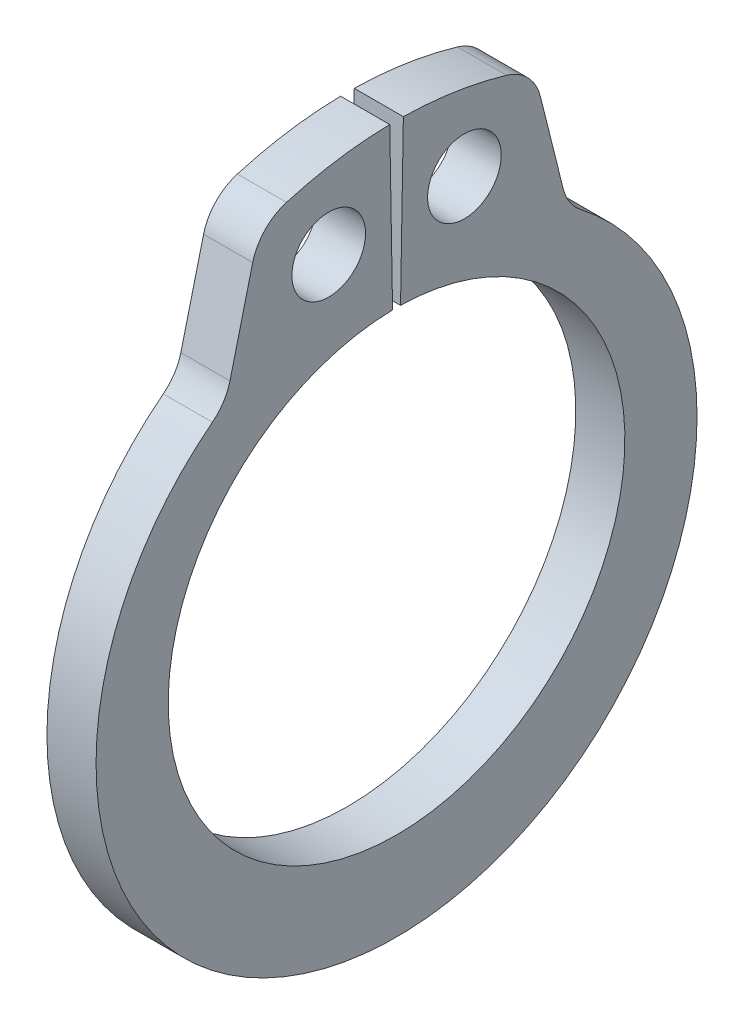
ISO-10303-21;
HEADER;
FILE_DESCRIPTION(('STEP AP214'),'2;1');
FILE_NAME('part.step','',(''),(''),'','','');
FILE_SCHEMA(('AUTOMOTIVE_DESIGN { 1 0 10303 214 1 1 1 1 }'));
ENDSEC;
DATA;
#1=APPLICATION_CONTEXT('core data for automotive mechanical design processes');
#2=APPLICATION_PROTOCOL_DEFINITION('international standard','automotive_design',2000,#1);
#3=PRODUCT_CONTEXT('',#1,'mechanical');
#4=PRODUCT('Part','Part','',(#3));
#5=PRODUCT_RELATED_PRODUCT_CATEGORY('part','',(#4));
#6=PRODUCT_DEFINITION_FORMATION('','',#4);
#7=PRODUCT_DEFINITION_CONTEXT('part definition',#1,'design');
#8=PRODUCT_DEFINITION('design','',#6,#7);
#9=PRODUCT_DEFINITION_SHAPE('','',#8);
#10=(LENGTH_UNIT() NAMED_UNIT(*) SI_UNIT(.MILLI.,.METRE.));
#11=(NAMED_UNIT(*) PLANE_ANGLE_UNIT() SI_UNIT($,.RADIAN.));
#12=(NAMED_UNIT(*) SI_UNIT($,.STERADIAN.) SOLID_ANGLE_UNIT());
#13=UNCERTAINTY_MEASURE_WITH_UNIT(LENGTH_MEASURE(1.E-05),#10,'distance_accuracy_value','');
#14=(GEOMETRIC_REPRESENTATION_CONTEXT(3) GLOBAL_UNCERTAINTY_ASSIGNED_CONTEXT((#13)) GLOBAL_UNIT_ASSIGNED_CONTEXT((#10,
#11,#12)) REPRESENTATION_CONTEXT('',''));
#15=CARTESIAN_POINT('',(0.,0.,0.));
#16=DIRECTION('',(0.,0.,1.));
#17=DIRECTION('',(1.,0.,0.));
#18=AXIS2_PLACEMENT_3D('',#15,#16,#17);
#19=CARTESIAN_POINT('',(0.5,0.,0.));
#20=DIRECTION('',(1.,0.,0.));
#21=DIRECTION('',(0.,0.,-1.));
#22=AXIS2_PLACEMENT_3D('',#19,#20,#21);
#23=PLANE('',#22);
#24=CARTESIAN_POINT('',(0.5,6.27684805964758,1.38135304154999));
#25=DIRECTION('',(1.,0.,0.));
#26=DIRECTION('',(0.,0.,-1.));
#27=AXIS2_PLACEMENT_3D('',#24,#25,#26);
#28=CIRCLE('',#27,0.75);
#29=CARTESIAN_POINT('',(0.5,6.27684805964758,0.631353041549988));
#30=VERTEX_POINT('',#29);
#31=EDGE_CURVE('E222',#30,#30,#28,.T.);
#32=ORIENTED_EDGE('',*,*,#31,.F.);
#33=EDGE_LOOP('',(#32));
#34=FACE_BOUND('',#33,.T.);
#35=CARTESIAN_POINT('',(0.5,0.,0.));
#36=DIRECTION('',(1.,0.,0.));
#37=DIRECTION('',(0.,0.,-1.));
#38=AXIS2_PLACEMENT_3D('',#35,#36,#37);
#39=CIRCLE('',#38,7.95000000000002);
#40=CARTESIAN_POINT('',(0.5,7.9487891764933,0.138746631176398));
#41=VERTEX_POINT('',#40);
#42=CARTESIAN_POINT('',(0.5,7.62758884850803,2.24106857505875));
#43=VERTEX_POINT('',#42);
#44=EDGE_CURVE('E139',#41,#43,#39,.T.);
#45=ORIENTED_EDGE('',*,*,#44,.T.);
#46=CARTESIAN_POINT('',(0.5,6.66814371033092,1.95917315681236));
#47=DIRECTION('',(1.,0.,0.));
#48=DIRECTION('',(0.,0.,-1.));
#49=AXIS2_PLACEMENT_3D('',#46,#47,#48);
#50=CIRCLE('',#49,1.);
#51=CARTESIAN_POINT('',(0.5,6.91006560593059,2.92946888308837));
#52=VERTEX_POINT('',#51);
#53=EDGE_CURVE('E176',#43,#52,#50,.T.);
#54=ORIENTED_EDGE('',*,*,#53,.T.);
#55=DIRECTION('',(0.,-0.970295726275997,0.241921895599665));
#56=VECTOR('',#55,1.);
#57=CARTESIAN_POINT('',(0.5,7.4417632657332,2.79690176745338));
#58=LINE('',#57,#56);
#59=CARTESIAN_POINT('',(0.5,5.05284690687498,3.3925255121669));
#60=VERTEX_POINT('',#59);
#61=EDGE_CURVE('E214',#52,#60,#58,.T.);
#62=ORIENTED_EDGE('',*,*,#61,.T.);
#63=CARTESIAN_POINT('',(0.5,5.29476880247463,4.36282123844291));
#64=DIRECTION('',(1.,0.,0.));
#65=DIRECTION('',(0.,0.,-1.));
#66=AXIS2_PLACEMENT_3D('',#63,#64,#65);
#67=CIRCLE('',#66,1.);
#68=CARTESIAN_POINT('',(0.5,4.50455452619233,3.74999059498615));
#69=VERTEX_POINT('',#68);
#70=EDGE_CURVE('E187',#60,#69,#67,.F.);
#71=ORIENTED_EDGE('',*,*,#70,.T.);
#72=CARTESIAN_POINT('',(0.5,-0.330869641515005,0.));
#73=DIRECTION('',(1.,0.,0.));
#74=DIRECTION('',(0.,0.,-1.));
#75=AXIS2_PLACEMENT_3D('',#72,#73,#74);
#76=CIRCLE('',#75,6.11913035848499);
#77=CARTESIAN_POINT('',(0.5,4.50455452619232,-3.74999059498615));
#78=VERTEX_POINT('',#77);
#79=EDGE_CURVE('E209',#69,#78,#76,.T.);
#80=ORIENTED_EDGE('',*,*,#79,.T.);
#81=CARTESIAN_POINT('',(0.5,5.29476880247463,-4.36282123844291));
#82=DIRECTION('',(1.,0.,0.));
#83=DIRECTION('',(0.,0.,-1.));
#84=AXIS2_PLACEMENT_3D('',#81,#82,#83);
#85=CIRCLE('',#84,1.);
#86=CARTESIAN_POINT('',(0.5,5.05284690687498,-3.39252551216691));
#87=VERTEX_POINT('',#86);
#88=EDGE_CURVE('E11',#78,#87,#85,.F.);
#89=ORIENTED_EDGE('',*,*,#88,.T.);
#90=DIRECTION('',(0.,0.970295726275997,0.241921895599665));
#91=VECTOR('',#90,1.);
#92=CARTESIAN_POINT('',(0.5,7.4417632657332,-2.7969017674534));
#93=LINE('',#92,#91);
#94=CARTESIAN_POINT('',(0.5,6.91006560593059,-2.92946888308837));
#95=VERTEX_POINT('',#94);
#96=EDGE_CURVE('E208',#87,#95,#93,.T.);
#97=ORIENTED_EDGE('',*,*,#96,.T.);
#98=CARTESIAN_POINT('',(0.5,6.66814371033092,-1.95917315681238));
#99=DIRECTION('',(1.,0.,0.));
#100=DIRECTION('',(0.,0.,-1.));
#101=AXIS2_PLACEMENT_3D('',#98,#99,#100);
#102=CIRCLE('',#101,1.);
#103=CARTESIAN_POINT('',(0.5,7.62758884850803,-2.24106857505875));
#104=VERTEX_POINT('',#103);
#105=EDGE_CURVE('E54',#95,#104,#102,.T.);
#106=ORIENTED_EDGE('',*,*,#105,.T.);
#107=CARTESIAN_POINT('',(0.5,0.,0.));
#108=DIRECTION('',(1.,0.,0.));
#109=DIRECTION('',(0.,0.,1.));
#110=AXIS2_PLACEMENT_3D('',#107,#108,#109);
#111=CIRCLE('',#110,7.95);
#112=CARTESIAN_POINT('',(0.5,7.9487891764933,-0.138746631176412));
#113=VERTEX_POINT('',#112);
#114=EDGE_CURVE('E211',#104,#113,#111,.T.);
#115=ORIENTED_EDGE('',*,*,#114,.T.);
#116=DIRECTION('',(0.,-0.999847695156391,0.017452406437284));
#117=VECTOR('',#116,1.);
#118=CARTESIAN_POINT('',(0.5,7.94878917649332,-0.138746631176412));
#119=LINE('',#118,#117);
#120=CARTESIAN_POINT('',(0.5,4.64929178247722,-0.0811536899333748));
#121=VERTEX_POINT('',#120);
#122=EDGE_CURVE('E145',#113,#121,#119,.T.);
#123=ORIENTED_EDGE('',*,*,#122,.T.);
#124=CARTESIAN_POINT('',(0.5,0.,0.));
#125=DIRECTION('',(-1.,0.,0.));
#126=DIRECTION('',(0.,0.,-1.));
#127=AXIS2_PLACEMENT_3D('',#124,#125,#126);
#128=CIRCLE('',#127,4.65);
#129=CARTESIAN_POINT('',(0.5,4.64929178247722,0.0811536899333748));
#130=VERTEX_POINT('',#129);
#131=EDGE_CURVE('E140',#121,#130,#128,.T.);
#132=ORIENTED_EDGE('',*,*,#131,.T.);
#133=DIRECTION('',(0.,0.999847695156391,0.0174524064372835));
#134=VECTOR('',#133,1.);
#135=CARTESIAN_POINT('',(0.5,4.64929178247722,0.0811536899333748));
#136=LINE('',#135,#134);
#137=EDGE_CURVE('E129',#130,#41,#136,.T.);
#138=ORIENTED_EDGE('',*,*,#137,.T.);
#139=EDGE_LOOP('',(#45,#54,#62,#71,#80,#89,#97,#106,#115,#123,#132,#138));
#140=FACE_BOUND('',#139,.T.);
#141=CARTESIAN_POINT('',(0.5,6.27684805964758,-1.38135304154999));
#142=DIRECTION('',(1.,0.,0.));
#143=DIRECTION('',(0.,0.,-1.));
#144=AXIS2_PLACEMENT_3D('',#141,#142,#143);
#145=CIRCLE('',#144,0.75);
#146=CARTESIAN_POINT('',(0.5,6.27684805964758,-2.13135304154999));
#147=VERTEX_POINT('',#146);
#148=EDGE_CURVE('E251',#147,#147,#145,.T.);
#149=ORIENTED_EDGE('',*,*,#148,.F.);
#150=EDGE_LOOP('',(#149));
#151=FACE_BOUND('',#150,.T.);
#152=ADVANCED_FACE('F39',(#34,#140,#151),#23,.T.);
#153=CARTESIAN_POINT('',(-0.5,0.,0.));
#154=DIRECTION('',(1.,0.,0.));
#155=DIRECTION('',(0.,0.,-1.));
#156=AXIS2_PLACEMENT_3D('',#153,#154,#155);
#157=PLANE('',#156);
#158=CARTESIAN_POINT('',(-0.5,6.27684805964758,1.38135304154999));
#159=DIRECTION('',(1.,0.,0.));
#160=DIRECTION('',(0.,0.,-1.));
#161=AXIS2_PLACEMENT_3D('',#158,#159,#160);
#162=CIRCLE('',#161,0.75);
#163=CARTESIAN_POINT('',(-0.5,6.27684805964758,0.631353041549988));
#164=VERTEX_POINT('',#163);
#165=EDGE_CURVE('E248',#164,#164,#162,.T.);
#166=ORIENTED_EDGE('',*,*,#165,.T.);
#167=EDGE_LOOP('',(#166));
#168=FACE_BOUND('',#167,.T.);
#169=DIRECTION('',(0.,-0.970295726275997,0.241921895599665));
#170=VECTOR('',#169,1.);
#171=CARTESIAN_POINT('',(-0.5,7.4417632657332,2.79690176745338));
#172=LINE('',#171,#170);
#173=CARTESIAN_POINT('',(-0.5,6.91006560593059,2.92946888308837));
#174=VERTEX_POINT('',#173);
#175=CARTESIAN_POINT('',(-0.5,5.05284690687498,3.3925255121669));
#176=VERTEX_POINT('',#175);
#177=EDGE_CURVE('E205',#174,#176,#172,.T.);
#178=ORIENTED_EDGE('',*,*,#177,.F.);
#179=CARTESIAN_POINT('',(-0.5,6.66814371033092,1.95917315681236));
#180=DIRECTION('',(1.,0.,0.));
#181=DIRECTION('',(0.,0.,-1.));
#182=AXIS2_PLACEMENT_3D('',#179,#180,#181);
#183=CIRCLE('',#182,1.);
#184=CARTESIAN_POINT('',(-0.5,7.62758884850803,2.24106857505875));
#185=VERTEX_POINT('',#184);
#186=EDGE_CURVE('E171',#174,#185,#183,.F.);
#187=ORIENTED_EDGE('',*,*,#186,.T.);
#188=CARTESIAN_POINT('',(-0.5,0.,0.));
#189=DIRECTION('',(1.,0.,0.));
#190=DIRECTION('',(0.,0.,-1.));
#191=AXIS2_PLACEMENT_3D('',#188,#189,#190);
#192=CIRCLE('',#191,7.95000000000002);
#193=CARTESIAN_POINT('',(-0.5,7.9487891764933,0.138746631176398));
#194=VERTEX_POINT('',#193);
#195=EDGE_CURVE('E224',#194,#185,#192,.T.);
#196=ORIENTED_EDGE('',*,*,#195,.F.);
#197=DIRECTION('',(0.,0.999847695156391,0.0174524064372835));
#198=VECTOR('',#197,1.);
#199=CARTESIAN_POINT('',(-0.5,4.64929178247722,0.0811536899333748));
#200=LINE('',#199,#198);
#201=CARTESIAN_POINT('',(-0.5,4.64929178247722,0.0811536899333748));
#202=VERTEX_POINT('',#201);
#203=EDGE_CURVE('E221',#202,#194,#200,.T.);
#204=ORIENTED_EDGE('',*,*,#203,.F.);
#205=CARTESIAN_POINT('',(-0.5,0.,0.));
#206=DIRECTION('',(-1.,0.,0.));
#207=DIRECTION('',(0.,0.,-1.));
#208=AXIS2_PLACEMENT_3D('',#205,#206,#207);
#209=CIRCLE('',#208,4.65);
#210=CARTESIAN_POINT('',(-0.5,4.64929178247722,-0.0811536899333748));
#211=VERTEX_POINT('',#210);
#212=EDGE_CURVE('E153',#211,#202,#209,.T.);
#213=ORIENTED_EDGE('',*,*,#212,.F.);
#214=DIRECTION('',(0.,-0.999847695156391,0.017452406437284));
#215=VECTOR('',#214,1.);
#216=CARTESIAN_POINT('',(-0.5,7.94878917649332,-0.138746631176412));
#217=LINE('',#216,#215);
#218=CARTESIAN_POINT('',(-0.5,7.9487891764933,-0.138746631176412));
#219=VERTEX_POINT('',#218);
#220=EDGE_CURVE('E149',#219,#211,#217,.T.);
#221=ORIENTED_EDGE('',*,*,#220,.F.);
#222=CARTESIAN_POINT('',(-0.5,0.,0.));
#223=DIRECTION('',(1.,0.,0.));
#224=DIRECTION('',(0.,0.,1.));
#225=AXIS2_PLACEMENT_3D('',#222,#223,#224);
#226=CIRCLE('',#225,7.95);
#227=CARTESIAN_POINT('',(-0.5,7.62758884850803,-2.24106857505875));
#228=VERTEX_POINT('',#227);
#229=EDGE_CURVE('E230',#228,#219,#226,.T.);
#230=ORIENTED_EDGE('',*,*,#229,.F.);
#231=CARTESIAN_POINT('',(-0.5,6.66814371033092,-1.95917315681238));
#232=DIRECTION('',(1.,0.,0.));
#233=DIRECTION('',(0.,0.,-1.));
#234=AXIS2_PLACEMENT_3D('',#231,#232,#233);
#235=CIRCLE('',#234,1.);
#236=CARTESIAN_POINT('',(-0.5,6.91006560593059,-2.92946888308837));
#237=VERTEX_POINT('',#236);
#238=EDGE_CURVE('E169',#228,#237,#235,.F.);
#239=ORIENTED_EDGE('',*,*,#238,.T.);
#240=DIRECTION('',(0.,0.970295726275997,0.241921895599665));
#241=VECTOR('',#240,1.);
#242=CARTESIAN_POINT('',(-0.5,7.4417632657332,-2.7969017674534));
#243=LINE('',#242,#241);
#244=CARTESIAN_POINT('',(-0.5,5.05284690687498,-3.39252551216691));
#245=VERTEX_POINT('',#244);
#246=EDGE_CURVE('E196',#245,#237,#243,.T.);
#247=ORIENTED_EDGE('',*,*,#246,.F.);
#248=CARTESIAN_POINT('',(-0.5,5.29476880247463,-4.36282123844291));
#249=DIRECTION('',(1.,0.,0.));
#250=DIRECTION('',(0.,0.,-1.));
#251=AXIS2_PLACEMENT_3D('',#248,#249,#250);
#252=CIRCLE('',#251,1.);
#253=CARTESIAN_POINT('',(-0.5,4.50455452619232,-3.74999059498615));
#254=VERTEX_POINT('',#253);
#255=EDGE_CURVE('E47',#245,#254,#252,.T.);
#256=ORIENTED_EDGE('',*,*,#255,.T.);
#257=CARTESIAN_POINT('',(-0.5,-0.330869641515005,0.));
#258=DIRECTION('',(1.,0.,0.));
#259=DIRECTION('',(0.,0.,-1.));
#260=AXIS2_PLACEMENT_3D('',#257,#258,#259);
#261=CIRCLE('',#260,6.11913035848499);
#262=CARTESIAN_POINT('',(-0.5,4.50455452619233,3.74999059498615));
#263=VERTEX_POINT('',#262);
#264=EDGE_CURVE('E195',#263,#254,#261,.T.);
#265=ORIENTED_EDGE('',*,*,#264,.F.);
#266=CARTESIAN_POINT('',(-0.5,5.29476880247463,4.36282123844291));
#267=DIRECTION('',(1.,0.,0.));
#268=DIRECTION('',(0.,0.,-1.));
#269=AXIS2_PLACEMENT_3D('',#266,#267,#268);
#270=CIRCLE('',#269,1.);
#271=EDGE_CURVE('E185',#263,#176,#270,.T.);
#272=ORIENTED_EDGE('',*,*,#271,.T.);
#273=EDGE_LOOP('',(#178,#187,#196,#204,#213,#221,#230,#239,#247,#256,#265,#272));
#274=FACE_BOUND('',#273,.T.);
#275=CARTESIAN_POINT('',(-0.5,6.27684805964758,-1.38135304154999));
#276=DIRECTION('',(1.,0.,0.));
#277=DIRECTION('',(0.,0.,-1.));
#278=AXIS2_PLACEMENT_3D('',#275,#276,#277);
#279=CIRCLE('',#278,0.75);
#280=CARTESIAN_POINT('',(-0.5,6.27684805964758,-2.13135304154999));
#281=VERTEX_POINT('',#280);
#282=EDGE_CURVE('E254',#281,#281,#279,.T.);
#283=ORIENTED_EDGE('',*,*,#282,.T.);
#284=EDGE_LOOP('',(#283));
#285=FACE_BOUND('',#284,.T.);
#286=ADVANCED_FACE('F193',(#168,#274,#285),#157,.F.);
#287=CARTESIAN_POINT('',(0.5,0.,0.));
#288=DIRECTION('',(-1.,0.,0.));
#289=DIRECTION('',(0.,0.,1.));
#290=AXIS2_PLACEMENT_3D('',#287,#288,#289);
#291=CYLINDRICAL_SURFACE('',#290,4.65);
#292=ORIENTED_EDGE('',*,*,#212,.T.);
#293=DIRECTION('',(-1.,0.,0.));
#294=VECTOR('',#293,1.);
#295=CARTESIAN_POINT('',(0.5,4.64929178247722,0.0811536899333748));
#296=LINE('',#295,#294);
#297=EDGE_CURVE('E133',#130,#202,#296,.T.);
#298=ORIENTED_EDGE('',*,*,#297,.F.);
#299=ORIENTED_EDGE('',*,*,#131,.F.);
#300=DIRECTION('',(-1.,0.,0.));
#301=VECTOR('',#300,1.);
#302=CARTESIAN_POINT('',(0.5,4.64929178247722,-0.0811536899333748));
#303=LINE('',#302,#301);
#304=EDGE_CURVE('E219',#121,#211,#303,.T.);
#305=ORIENTED_EDGE('',*,*,#304,.T.);
#306=EDGE_LOOP('',(#292,#298,#299,#305));
#307=FACE_BOUND('',#306,.T.);
#308=ADVANCED_FACE('F151',(#307),#291,.F.);
#309=CARTESIAN_POINT('',(0.5,4.64929178247722,0.0811536899333748));
#310=DIRECTION('',(0.,-0.0174524064372835,0.999847695156391));
#311=DIRECTION('',(0.,-0.999847695156391,-0.0174524064372835));
#312=AXIS2_PLACEMENT_3D('',#309,#310,#311);
#313=PLANE('',#312);
#314=ORIENTED_EDGE('',*,*,#203,.T.);
#315=DIRECTION('',(-1.,0.,0.));
#316=VECTOR('',#315,1.);
#317=CARTESIAN_POINT('',(0.5,7.9487891764933,0.138746631176398));
#318=LINE('',#317,#316);
#319=EDGE_CURVE('E136',#41,#194,#318,.T.);
#320=ORIENTED_EDGE('',*,*,#319,.F.);
#321=ORIENTED_EDGE('',*,*,#137,.F.);
#322=ORIENTED_EDGE('',*,*,#297,.T.);
#323=EDGE_LOOP('',(#314,#320,#321,#322));
#324=FACE_BOUND('',#323,.T.);
#325=ADVANCED_FACE('F131',(#324),#313,.F.);
#326=CARTESIAN_POINT('',(0.5,0.,0.));
#327=DIRECTION('',(-1.,0.,0.));
#328=DIRECTION('',(0.,0.,1.));
#329=AXIS2_PLACEMENT_3D('',#326,#327,#328);
#330=CYLINDRICAL_SURFACE('',#329,7.95000000000002);
#331=ORIENTED_EDGE('',*,*,#195,.T.);
#332=DIRECTION('',(-1.,0.,0.));
#333=VECTOR('',#332,1.);
#334=CARTESIAN_POINT('',(0.5,7.62758884850803,2.24106857505875));
#335=LINE('',#334,#333);
#336=EDGE_CURVE('E173',#185,#43,#335,.F.);
#337=ORIENTED_EDGE('',*,*,#336,.T.);
#338=ORIENTED_EDGE('',*,*,#44,.F.);
#339=ORIENTED_EDGE('',*,*,#319,.T.);
#340=EDGE_LOOP('',(#331,#337,#338,#339));
#341=FACE_BOUND('',#340,.T.);
#342=ADVANCED_FACE('F242',(#341),#330,.T.);
#343=CARTESIAN_POINT('',(0.5,7.4417632657332,2.79690176745338));
#344=DIRECTION('',(0.,-0.241921895599665,-0.970295726275997));
#345=DIRECTION('',(0.,0.970295726275997,-0.241921895599665));
#346=AXIS2_PLACEMENT_3D('',#343,#344,#345);
#347=PLANE('',#346);
#348=ORIENTED_EDGE('',*,*,#177,.T.);
#349=DIRECTION('',(1.,0.,0.));
#350=VECTOR('',#349,1.);
#351=CARTESIAN_POINT('',(0.5,5.05284690687498,3.3925255121669));
#352=LINE('',#351,#350);
#353=EDGE_CURVE('E167',#176,#60,#352,.T.);
#354=ORIENTED_EDGE('',*,*,#353,.T.);
#355=ORIENTED_EDGE('',*,*,#61,.F.);
#356=DIRECTION('',(-1.,0.,0.));
#357=VECTOR('',#356,1.);
#358=CARTESIAN_POINT('',(0.5,6.91006560593059,2.92946888308837));
#359=LINE('',#358,#357);
#360=EDGE_CURVE('E164',#52,#174,#359,.T.);
#361=ORIENTED_EDGE('',*,*,#360,.T.);
#362=EDGE_LOOP('',(#348,#354,#355,#361));
#363=FACE_BOUND('',#362,.T.);
#364=ADVANCED_FACE('F284',(#363),#347,.F.);
#365=CARTESIAN_POINT('',(0.5,-0.330869641515005,0.));
#366=DIRECTION('',(-1.,0.,0.));
#367=DIRECTION('',(0.,0.,1.));
#368=AXIS2_PLACEMENT_3D('',#365,#366,#367);
#369=CYLINDRICAL_SURFACE('',#368,6.11913035848499);
#370=ORIENTED_EDGE('',*,*,#79,.F.);
#371=DIRECTION('',(-1.,0.,0.));
#372=VECTOR('',#371,1.);
#373=CARTESIAN_POINT('',(0.5,4.50455452619233,3.74999059498615));
#374=LINE('',#373,#372);
#375=EDGE_CURVE('E156',#69,#263,#374,.T.);
#376=ORIENTED_EDGE('',*,*,#375,.T.);
#377=ORIENTED_EDGE('',*,*,#264,.T.);
#378=DIRECTION('',(-1.,0.,0.));
#379=VECTOR('',#378,1.);
#380=CARTESIAN_POINT('',(0.5,4.50455452619232,-3.74999059498615));
#381=LINE('',#380,#379);
#382=EDGE_CURVE('E154',#254,#78,#381,.F.);
#383=ORIENTED_EDGE('',*,*,#382,.T.);
#384=EDGE_LOOP('',(#370,#376,#377,#383));
#385=FACE_BOUND('',#384,.T.);
#386=ADVANCED_FACE('F202',(#385),#369,.T.);
#387=CARTESIAN_POINT('',(0.5,7.4417632657332,-2.7969017674534));
#388=DIRECTION('',(0.,-0.241921895599665,0.970295726275997));
#389=DIRECTION('',(0.,-0.970295726275997,-0.241921895599665));
#390=AXIS2_PLACEMENT_3D('',#387,#388,#389);
#391=PLANE('',#390);
#392=ORIENTED_EDGE('',*,*,#246,.T.);
#393=DIRECTION('',(-1.,0.,0.));
#394=VECTOR('',#393,1.);
#395=CARTESIAN_POINT('',(0.5,6.91006560593059,-2.92946888308837));
#396=LINE('',#395,#394);
#397=EDGE_CURVE('E62',#237,#95,#396,.F.);
#398=ORIENTED_EDGE('',*,*,#397,.T.);
#399=ORIENTED_EDGE('',*,*,#96,.F.);
#400=DIRECTION('',(1.,0.,0.));
#401=VECTOR('',#400,1.);
#402=CARTESIAN_POINT('',(-0.5,5.05284690687498,-3.39252551216691));
#403=LINE('',#402,#401);
#404=EDGE_CURVE('E181',#87,#245,#403,.F.);
#405=ORIENTED_EDGE('',*,*,#404,.T.);
#406=EDGE_LOOP('',(#392,#398,#399,#405));
#407=FACE_BOUND('',#406,.T.);
#408=ADVANCED_FACE('F210',(#407),#391,.F.);
#409=CARTESIAN_POINT('',(0.5,0.,0.));
#410=DIRECTION('',(-1.,0.,0.));
#411=DIRECTION('',(0.,0.,1.));
#412=AXIS2_PLACEMENT_3D('',#409,#410,#411);
#413=CYLINDRICAL_SURFACE('',#412,7.95);
#414=ORIENTED_EDGE('',*,*,#114,.F.);
#415=DIRECTION('',(-1.,0.,0.));
#416=VECTOR('',#415,1.);
#417=CARTESIAN_POINT('',(0.5,7.62758884850803,-2.24106857505875));
#418=LINE('',#417,#416);
#419=EDGE_CURVE('E178',#104,#228,#418,.T.);
#420=ORIENTED_EDGE('',*,*,#419,.T.);
#421=ORIENTED_EDGE('',*,*,#229,.T.);
#422=DIRECTION('',(-1.,0.,0.));
#423=VECTOR('',#422,1.);
#424=CARTESIAN_POINT('',(0.5,7.9487891764933,-0.138746631176412));
#425=LINE('',#424,#423);
#426=EDGE_CURVE('E158',#113,#219,#425,.T.);
#427=ORIENTED_EDGE('',*,*,#426,.F.);
#428=EDGE_LOOP('',(#414,#420,#421,#427));
#429=FACE_BOUND('',#428,.T.);
#430=ADVANCED_FACE('F277',(#429),#413,.T.);
#431=CARTESIAN_POINT('',(0.5,7.94878917649332,-0.138746631176412));
#432=DIRECTION('',(0.,-0.017452406437284,-0.999847695156391));
#433=DIRECTION('',(0.,0.999847695156391,-0.017452406437284));
#434=AXIS2_PLACEMENT_3D('',#431,#432,#433);
#435=PLANE('',#434);
#436=ORIENTED_EDGE('',*,*,#220,.T.);
#437=ORIENTED_EDGE('',*,*,#304,.F.);
#438=ORIENTED_EDGE('',*,*,#122,.F.);
#439=ORIENTED_EDGE('',*,*,#426,.T.);
#440=EDGE_LOOP('',(#436,#437,#438,#439));
#441=FACE_BOUND('',#440,.T.);
#442=ADVANCED_FACE('F237',(#441),#435,.F.);
#443=CARTESIAN_POINT('',(0.5,6.27684805964758,1.38135304154999));
#444=DIRECTION('',(-1.,0.,0.));
#445=DIRECTION('',(0.,0.,1.));
#446=AXIS2_PLACEMENT_3D('',#443,#444,#445);
#447=CYLINDRICAL_SURFACE('',#446,0.75);
#448=ORIENTED_EDGE('',*,*,#31,.T.);
#449=EDGE_LOOP('',(#448));
#450=FACE_BOUND('',#449,.T.);
#451=ORIENTED_EDGE('',*,*,#165,.F.);
#452=EDGE_LOOP('',(#451));
#453=FACE_BOUND('',#452,.T.);
#454=ADVANCED_FACE('F272',(#450,#453),#447,.F.);
#455=CARTESIAN_POINT('',(0.5,6.27684805964758,-1.38135304154999));
#456=DIRECTION('',(-1.,0.,0.));
#457=DIRECTION('',(0.,0.,1.));
#458=AXIS2_PLACEMENT_3D('',#455,#456,#457);
#459=CYLINDRICAL_SURFACE('',#458,0.75);
#460=ORIENTED_EDGE('',*,*,#148,.T.);
#461=EDGE_LOOP('',(#460));
#462=FACE_BOUND('',#461,.T.);
#463=ORIENTED_EDGE('',*,*,#282,.F.);
#464=EDGE_LOOP('',(#463));
#465=FACE_BOUND('',#464,.T.);
#466=ADVANCED_FACE('F260',(#462,#465),#459,.F.);
#467=CARTESIAN_POINT('',(0.5,5.29476880247463,4.36282123844291));
#468=DIRECTION('',(-1.,0.,0.));
#469=DIRECTION('',(0.,0.,1.));
#470=AXIS2_PLACEMENT_3D('',#467,#468,#469);
#471=CYLINDRICAL_SURFACE('',#470,1.);
#472=ORIENTED_EDGE('',*,*,#70,.F.);
#473=ORIENTED_EDGE('',*,*,#353,.F.);
#474=ORIENTED_EDGE('',*,*,#271,.F.);
#475=ORIENTED_EDGE('',*,*,#375,.F.);
#476=EDGE_LOOP('',(#472,#473,#474,#475));
#477=FACE_BOUND('',#476,.T.);
#478=ADVANCED_FACE('F294',(#477),#471,.F.);
#479=CARTESIAN_POINT('',(0.5,6.66814371033092,1.95917315681236));
#480=DIRECTION('',(-1.,0.,0.));
#481=DIRECTION('',(0.,0.,1.));
#482=AXIS2_PLACEMENT_3D('',#479,#480,#481);
#483=CYLINDRICAL_SURFACE('',#482,1.);
#484=ORIENTED_EDGE('',*,*,#53,.F.);
#485=ORIENTED_EDGE('',*,*,#336,.F.);
#486=ORIENTED_EDGE('',*,*,#186,.F.);
#487=ORIENTED_EDGE('',*,*,#360,.F.);
#488=EDGE_LOOP('',(#484,#485,#486,#487));
#489=FACE_BOUND('',#488,.T.);
#490=ADVANCED_FACE('F297',(#489),#483,.T.);
#491=CARTESIAN_POINT('',(0.5,6.66814371033092,-1.95917315681238));
#492=DIRECTION('',(-1.,0.,0.));
#493=DIRECTION('',(0.,0.,1.));
#494=AXIS2_PLACEMENT_3D('',#491,#492,#493);
#495=CYLINDRICAL_SURFACE('',#494,1.);
#496=ORIENTED_EDGE('',*,*,#105,.F.);
#497=ORIENTED_EDGE('',*,*,#397,.F.);
#498=ORIENTED_EDGE('',*,*,#238,.F.);
#499=ORIENTED_EDGE('',*,*,#419,.F.);
#500=EDGE_LOOP('',(#496,#497,#498,#499));
#501=FACE_BOUND('',#500,.T.);
#502=ADVANCED_FACE('F300',(#501),#495,.T.);
#503=CARTESIAN_POINT('',(0.5,5.29476880247463,-4.36282123844291));
#504=DIRECTION('',(-1.,0.,0.));
#505=DIRECTION('',(0.,0.,1.));
#506=AXIS2_PLACEMENT_3D('',#503,#504,#505);
#507=CYLINDRICAL_SURFACE('',#506,1.);
#508=ORIENTED_EDGE('',*,*,#88,.F.);
#509=ORIENTED_EDGE('',*,*,#382,.F.);
#510=ORIENTED_EDGE('',*,*,#255,.F.);
#511=ORIENTED_EDGE('',*,*,#404,.F.);
#512=EDGE_LOOP('',(#508,#509,#510,#511));
#513=FACE_BOUND('',#512,.T.);
#514=ADVANCED_FACE('F41',(#513),#507,.F.);
#515=CLOSED_SHELL('',(#152,#286,#308,#325,#342,#364,#386,#408,#430,#442,#454,#466,#478,#490,
#502,#514));
#516=MANIFOLD_SOLID_BREP('B2',#515);
#517=ADVANCED_BREP_SHAPE_REPRESENTATION('',(#18,#516),#14);
#518=SHAPE_DEFINITION_REPRESENTATION(#9,#517);
ENDSEC;
END-ISO-10303-21;
